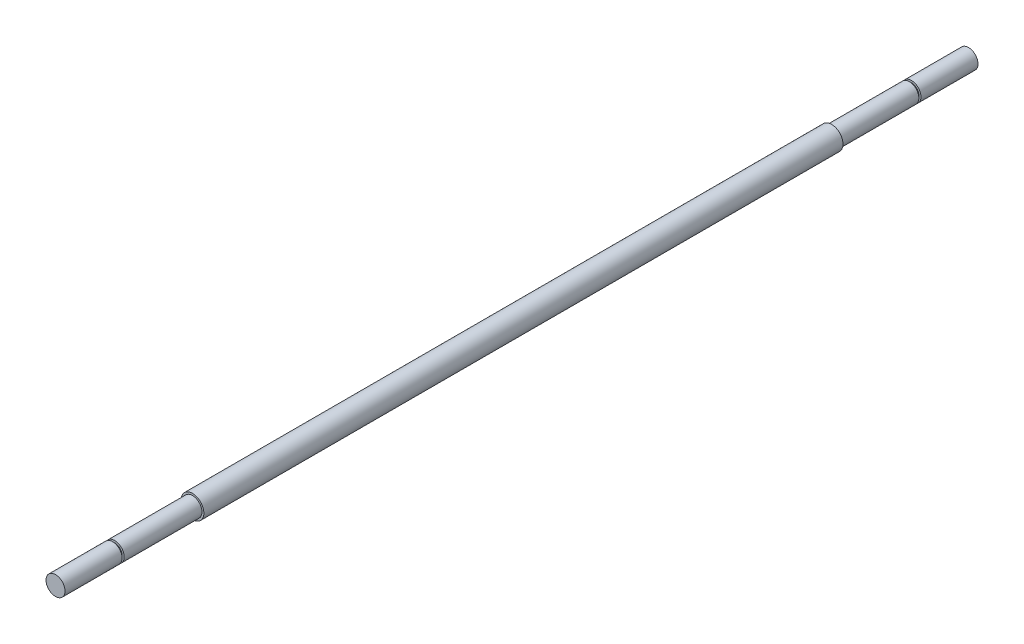
ISO-10303-21;
HEADER;
FILE_DESCRIPTION(('STEP AP214'),'2;1');
FILE_NAME('part.step','',(''),(''),'','','');
FILE_SCHEMA(('AUTOMOTIVE_DESIGN { 1 0 10303 214 1 1 1 1 }'));
ENDSEC;
DATA;
#1=APPLICATION_CONTEXT('core data for automotive mechanical design processes');
#2=APPLICATION_PROTOCOL_DEFINITION('international standard','automotive_design',2000,#1);
#3=PRODUCT_CONTEXT('',#1,'mechanical');
#4=PRODUCT('Part','Part','',(#3));
#5=PRODUCT_RELATED_PRODUCT_CATEGORY('part','',(#4));
#6=PRODUCT_DEFINITION_FORMATION('','',#4);
#7=PRODUCT_DEFINITION_CONTEXT('part definition',#1,'design');
#8=PRODUCT_DEFINITION('design','',#6,#7);
#9=PRODUCT_DEFINITION_SHAPE('','',#8);
#10=(LENGTH_UNIT() NAMED_UNIT(*) SI_UNIT(.MILLI.,.METRE.));
#11=(NAMED_UNIT(*) PLANE_ANGLE_UNIT() SI_UNIT($,.RADIAN.));
#12=(NAMED_UNIT(*) SI_UNIT($,.STERADIAN.) SOLID_ANGLE_UNIT());
#13=UNCERTAINTY_MEASURE_WITH_UNIT(LENGTH_MEASURE(1.E-05),#10,'distance_accuracy_value','');
#14=(GEOMETRIC_REPRESENTATION_CONTEXT(3) GLOBAL_UNCERTAINTY_ASSIGNED_CONTEXT((#13)) GLOBAL_UNIT_ASSIGNED_CONTEXT((#10,
#11,#12)) REPRESENTATION_CONTEXT('',''));
#15=CARTESIAN_POINT('',(0.,0.,0.));
#16=DIRECTION('',(0.,0.,1.));
#17=DIRECTION('',(1.,0.,0.));
#18=AXIS2_PLACEMENT_3D('',#15,#16,#17);
#19=CARTESIAN_POINT('',(0.,0.,608.819798673658));
#20=DIRECTION('',(0.,0.,1.));
#21=DIRECTION('',(-1.,0.,0.));
#22=AXIS2_PLACEMENT_3D('',#19,#20,#21);
#23=CYLINDRICAL_SURFACE('',#22,6.35);
#24=CARTESIAN_POINT('',(0.,0.,518.16));
#25=DIRECTION('',(0.,0.,-1.));
#26=DIRECTION('',(-1.,0.,0.));
#27=AXIS2_PLACEMENT_3D('',#24,#25,#26);
#28=CIRCLE('',#27,6.35);
#29=CARTESIAN_POINT('',(-6.35,0.,518.16));
#30=VERTEX_POINT('',#29);
#31=EDGE_CURVE('E75',#30,#30,#28,.T.);
#32=ORIENTED_EDGE('',*,*,#31,.F.);
#33=EDGE_LOOP('',(#32));
#34=FACE_BOUND('',#33,.T.);
#35=CARTESIAN_POINT('',(0.,0.,570.103));
#36=DIRECTION('',(0.,0.,1.));
#37=DIRECTION('',(1.,0.,0.));
#38=AXIS2_PLACEMENT_3D('',#35,#36,#37);
#39=CIRCLE('',#38,6.35);
#40=CARTESIAN_POINT('',(6.35,0.,570.103));
#41=VERTEX_POINT('',#40);
#42=EDGE_CURVE('E65',#41,#41,#39,.T.);
#43=ORIENTED_EDGE('',*,*,#42,.F.);
#44=EDGE_LOOP('',(#43));
#45=FACE_BOUND('',#44,.T.);
#46=ADVANCED_FACE('F37',(#34,#45),#23,.T.);
#47=CARTESIAN_POINT('',(0.,0.,609.6));
#48=DIRECTION('',(0.,0.,-1.));
#49=DIRECTION('',(-1.,0.,0.));
#50=AXIS2_PLACEMENT_3D('',#47,#48,#49);
#51=CYLINDRICAL_SURFACE('',#50,7.62);
#52=CARTESIAN_POINT('',(0.,0.,91.44));
#53=DIRECTION('',(0.,0.,-1.));
#54=DIRECTION('',(-1.,0.,0.));
#55=AXIS2_PLACEMENT_3D('',#52,#53,#54);
#56=CIRCLE('',#55,7.62);
#57=CARTESIAN_POINT('',(-7.62,0.,91.44));
#58=VERTEX_POINT('',#57);
#59=EDGE_CURVE('E10',#58,#58,#56,.T.);
#60=CARTESIAN_POINT('',(0.,0.,518.16));
#61=DIRECTION('',(0.,0.,-1.));
#62=DIRECTION('',(-1.,0.,0.));
#63=AXIS2_PLACEMENT_3D('',#60,#61,#62);
#64=CIRCLE('',#63,7.62);
#65=CARTESIAN_POINT('',(-7.62,0.,518.16));
#66=VERTEX_POINT('',#65);
#67=EDGE_CURVE('E93',#66,#66,#64,.T.);
#68=CARTESIAN_POINT('',(-7.62,0.,91.44));
#69=CARTESIAN_POINT('',(-7.62,0.,95.885));
#70=CARTESIAN_POINT('',(-7.62,0.,100.33));
#71=CARTESIAN_POINT('',(-7.62,0.,109.22));
#72=CARTESIAN_POINT('',(-7.62,0.,113.665));
#73=CARTESIAN_POINT('',(-7.62,0.,122.555));
#74=CARTESIAN_POINT('',(-7.62,0.,127.));
#75=CARTESIAN_POINT('',(-7.62,0.,135.89));
#76=CARTESIAN_POINT('',(-7.62,0.,140.335));
#77=CARTESIAN_POINT('',(-7.62,0.,149.225));
#78=CARTESIAN_POINT('',(-7.62,0.,153.67));
#79=CARTESIAN_POINT('',(-7.62,0.,162.56));
#80=CARTESIAN_POINT('',(-7.62,0.,167.005));
#81=CARTESIAN_POINT('',(-7.62,0.,175.895));
#82=CARTESIAN_POINT('',(-7.62,0.,180.34));
#83=CARTESIAN_POINT('',(-7.62,0.,189.23));
#84=CARTESIAN_POINT('',(-7.62,0.,193.675));
#85=CARTESIAN_POINT('',(-7.62,0.,202.565));
#86=CARTESIAN_POINT('',(-7.62,0.,207.01));
#87=CARTESIAN_POINT('',(-7.62,0.,215.9));
#88=CARTESIAN_POINT('',(-7.62,0.,220.345));
#89=CARTESIAN_POINT('',(-7.62,0.,229.235));
#90=CARTESIAN_POINT('',(-7.62,0.,233.68));
#91=CARTESIAN_POINT('',(-7.62,0.,242.57));
#92=CARTESIAN_POINT('',(-7.62,0.,247.015));
#93=CARTESIAN_POINT('',(-7.62,0.,255.905));
#94=CARTESIAN_POINT('',(-7.62,0.,260.35));
#95=CARTESIAN_POINT('',(-7.62,0.,269.24));
#96=CARTESIAN_POINT('',(-7.62,0.,273.685));
#97=CARTESIAN_POINT('',(-7.62,0.,282.575));
#98=CARTESIAN_POINT('',(-7.62,0.,287.02));
#99=CARTESIAN_POINT('',(-7.62,0.,295.91));
#100=CARTESIAN_POINT('',(-7.62,0.,300.355));
#101=CARTESIAN_POINT('',(-7.62,0.,309.245));
#102=CARTESIAN_POINT('',(-7.62,0.,313.69));
#103=CARTESIAN_POINT('',(-7.62,0.,322.58));
#104=CARTESIAN_POINT('',(-7.62,0.,327.025));
#105=CARTESIAN_POINT('',(-7.62,0.,335.915));
#106=CARTESIAN_POINT('',(-7.62,0.,340.36));
#107=CARTESIAN_POINT('',(-7.62,0.,349.25));
#108=CARTESIAN_POINT('',(-7.62,0.,353.695));
#109=CARTESIAN_POINT('',(-7.62,0.,362.585));
#110=CARTESIAN_POINT('',(-7.62,0.,367.03));
#111=CARTESIAN_POINT('',(-7.62,0.,375.92));
#112=CARTESIAN_POINT('',(-7.62,0.,380.365));
#113=CARTESIAN_POINT('',(-7.62,0.,389.255));
#114=CARTESIAN_POINT('',(-7.62,0.,393.7));
#115=CARTESIAN_POINT('',(-7.62,0.,402.59));
#116=CARTESIAN_POINT('',(-7.62,0.,407.035));
#117=CARTESIAN_POINT('',(-7.62,0.,415.925));
#118=CARTESIAN_POINT('',(-7.62,0.,420.37));
#119=CARTESIAN_POINT('',(-7.62,0.,429.26));
#120=CARTESIAN_POINT('',(-7.62,0.,433.705));
#121=CARTESIAN_POINT('',(-7.62,0.,442.595));
#122=CARTESIAN_POINT('',(-7.62,0.,447.04));
#123=CARTESIAN_POINT('',(-7.62,0.,455.93));
#124=CARTESIAN_POINT('',(-7.62,0.,460.375));
#125=CARTESIAN_POINT('',(-7.62,0.,469.265));
#126=CARTESIAN_POINT('',(-7.62,0.,473.71));
#127=CARTESIAN_POINT('',(-7.62,0.,482.6));
#128=CARTESIAN_POINT('',(-7.62,0.,487.045));
#129=CARTESIAN_POINT('',(-7.62,0.,495.935));
#130=CARTESIAN_POINT('',(-7.62,0.,500.38));
#131=CARTESIAN_POINT('',(-7.62,0.,509.27));
#132=CARTESIAN_POINT('',(-7.62,0.,513.715));
#133=CARTESIAN_POINT('',(-7.62,0.,518.16));
#134=B_SPLINE_CURVE_WITH_KNOTS('',3,(#68,#69,#70,#71,#72,#73,#74,#75,#76,#77,#78,#79,#80,#81,
#82,#83,#84,#85,#86,#87,#88,#89,#90,#91,#92,#93,#94,#95,#96,#97,#98,#99,#100,#101,#102,#103,
#104,#105,#106,#107,#108,#109,#110,#111,#112,#113,#114,#115,#116,#117,#118,#119,#120,#121,#122,
#123,#124,#125,#126,#127,#128,#129,#130,#131,#132,#133),.UNSPECIFIED.,.F.,.F.,(4,2,2,2,2,2,2,2,
2,2,2,2,2,2,2,2,2,2,2,2,2,2,2,2,2,2,2,2,2,2,2,2,4),(0.,13.335,26.67,40.005,53.34,66.675,80.01,
93.345,106.68,120.015,133.35,146.685,160.02,173.355,186.69,200.025,213.36,226.695,240.03,
253.365,266.7,280.035,293.37,306.705,320.04,333.375,346.71,360.045,373.38,386.715,400.05,
413.385,426.72),.UNSPECIFIED.);
#135=EDGE_CURVE('BSEAM39',#58,#66,#134,.T.);
#136=ORIENTED_EDGE('',*,*,#59,.F.);
#137=ORIENTED_EDGE('',*,*,#67,.T.);
#138=ORIENTED_EDGE('',*,*,#135,.T.);
#139=ORIENTED_EDGE('',*,*,#135,.F.);
#140=EDGE_LOOP('',(#136,#138,#137,#139));
#141=FACE_BOUND('',#140,.T.);
#142=ADVANCED_FACE('F39',(#141),#51,.T.);
#143=CARTESIAN_POINT('',(0.,0.,0.78020132634235));
#144=DIRECTION('',(0.,0.,-1.));
#145=DIRECTION('',(-1.,0.,0.));
#146=AXIS2_PLACEMENT_3D('',#143,#144,#145);
#147=CYLINDRICAL_SURFACE('',#146,6.35);
#148=CARTESIAN_POINT('',(0.,0.,91.44));
#149=DIRECTION('',(0.,0.,-1.));
#150=DIRECTION('',(-1.,0.,0.));
#151=AXIS2_PLACEMENT_3D('',#148,#149,#150);
#152=CIRCLE('',#151,6.35);
#153=CARTESIAN_POINT('',(-6.35,0.,91.44));
#154=VERTEX_POINT('',#153);
#155=EDGE_CURVE('E53',#154,#154,#152,.T.);
#156=ORIENTED_EDGE('',*,*,#155,.T.);
#157=EDGE_LOOP('',(#156));
#158=FACE_BOUND('',#157,.T.);
#159=CARTESIAN_POINT('',(0.,0.,39.497));
#160=DIRECTION('',(0.,0.,-1.));
#161=DIRECTION('',(-1.,0.,0.));
#162=AXIS2_PLACEMENT_3D('',#159,#160,#161);
#163=CIRCLE('',#162,6.35);
#164=CARTESIAN_POINT('',(-6.35,0.,39.497));
#165=VERTEX_POINT('',#164);
#166=EDGE_CURVE('E57',#165,#165,#163,.T.);
#167=ORIENTED_EDGE('',*,*,#166,.F.);
#168=EDGE_LOOP('',(#167));
#169=FACE_BOUND('',#168,.T.);
#170=ADVANCED_FACE('F108',(#158,#169),#147,.T.);
#171=CARTESIAN_POINT('',(6.35,0.,91.44));
#172=DIRECTION('',(0.,0.,-1.));
#173=DIRECTION('',(-1.,0.,0.));
#174=AXIS2_PLACEMENT_3D('',#171,#172,#173);
#175=PLANE('',#174);
#176=ORIENTED_EDGE('',*,*,#59,.T.);
#177=EDGE_LOOP('',(#176));
#178=FACE_BOUND('',#177,.T.);
#179=ORIENTED_EDGE('',*,*,#155,.F.);
#180=EDGE_LOOP('',(#179));
#181=FACE_BOUND('',#180,.T.);
#182=ADVANCED_FACE('F111',(#178,#181),#175,.T.);
#183=CARTESIAN_POINT('',(7.6708,0.,38.1));
#184=DIRECTION('',(0.,0.,1.));
#185=DIRECTION('',(1.,0.,0.));
#186=AXIS2_PLACEMENT_3D('',#183,#184,#185);
#187=PLANE('',#186);
#188=CARTESIAN_POINT('',(0.,0.,38.1));
#189=DIRECTION('',(0.,0.,-1.));
#190=DIRECTION('',(-1.,0.,0.));
#191=AXIS2_PLACEMENT_3D('',#188,#189,#190);
#192=CIRCLE('',#191,5.0292);
#193=CARTESIAN_POINT('',(-5.0292,0.,38.1));
#194=VERTEX_POINT('',#193);
#195=EDGE_CURVE('E62',#194,#194,#192,.T.);
#196=ORIENTED_EDGE('',*,*,#195,.T.);
#197=EDGE_LOOP('',(#196));
#198=FACE_BOUND('',#197,.T.);
#199=CARTESIAN_POINT('',(0.,0.,38.1));
#200=DIRECTION('',(0.,0.,1.));
#201=DIRECTION('',(1.,0.,0.));
#202=AXIS2_PLACEMENT_3D('',#199,#200,#201);
#203=CIRCLE('',#202,6.35);
#204=CARTESIAN_POINT('',(6.35,0.,38.1));
#205=VERTEX_POINT('',#204);
#206=EDGE_CURVE('E61',#205,#205,#203,.T.);
#207=ORIENTED_EDGE('',*,*,#206,.T.);
#208=EDGE_LOOP('',(#207));
#209=FACE_BOUND('',#208,.T.);
#210=ADVANCED_FACE('F113',(#198,#209),#187,.T.);
#211=CARTESIAN_POINT('',(7.6708,0.,39.497));
#212=DIRECTION('',(0.,0.,-1.));
#213=DIRECTION('',(-1.,0.,0.));
#214=AXIS2_PLACEMENT_3D('',#211,#212,#213);
#215=PLANE('',#214);
#216=CARTESIAN_POINT('',(0.,0.,39.497));
#217=DIRECTION('',(0.,0.,-1.));
#218=DIRECTION('',(-1.,0.,0.));
#219=AXIS2_PLACEMENT_3D('',#216,#217,#218);
#220=CIRCLE('',#219,5.0292);
#221=CARTESIAN_POINT('',(-5.0292,0.,39.497));
#222=VERTEX_POINT('',#221);
#223=EDGE_CURVE('E97',#222,#222,#220,.T.);
#224=ORIENTED_EDGE('',*,*,#223,.F.);
#225=EDGE_LOOP('',(#224));
#226=FACE_BOUND('',#225,.T.);
#227=ORIENTED_EDGE('',*,*,#166,.T.);
#228=EDGE_LOOP('',(#227));
#229=FACE_BOUND('',#228,.T.);
#230=ADVANCED_FACE('F119',(#226,#229),#215,.T.);
#231=CARTESIAN_POINT('',(0.,0.,0.));
#232=DIRECTION('',(0.,0.,-1.));
#233=DIRECTION('',(-1.,0.,0.));
#234=AXIS2_PLACEMENT_3D('',#231,#232,#233);
#235=CYLINDRICAL_SURFACE('',#234,5.0292);
#236=ORIENTED_EDGE('',*,*,#223,.T.);
#237=EDGE_LOOP('',(#236));
#238=FACE_BOUND('',#237,.T.);
#239=ORIENTED_EDGE('',*,*,#195,.F.);
#240=EDGE_LOOP('',(#239));
#241=FACE_BOUND('',#240,.T.);
#242=ADVANCED_FACE('F231',(#238,#241),#235,.T.);
#243=CARTESIAN_POINT('',(0.,0.,0.));
#244=DIRECTION('',(0.,0.,1.));
#245=DIRECTION('',(1.,0.,0.));
#246=AXIS2_PLACEMENT_3D('',#243,#244,#245);
#247=PLANE('',#246);
#248=CARTESIAN_POINT('',(0.,0.,0.));
#249=DIRECTION('',(0.,0.,-1.));
#250=DIRECTION('',(-1.,0.,0.));
#251=AXIS2_PLACEMENT_3D('',#248,#249,#250);
#252=CIRCLE('',#251,6.35);
#253=CARTESIAN_POINT('',(-6.35,0.,0.));
#254=VERTEX_POINT('',#253);
#255=EDGE_CURVE('E46',#254,#254,#252,.T.);
#256=ORIENTED_EDGE('',*,*,#255,.T.);
#257=EDGE_LOOP('',(#256));
#258=FACE_BOUND('',#257,.T.);
#259=ADVANCED_FACE('F223',(#258),#247,.F.);
#260=ORIENTED_EDGE('',*,*,#255,.F.);
#261=EDGE_LOOP('',(#260));
#262=FACE_BOUND('',#261,.T.);
#263=ORIENTED_EDGE('',*,*,#206,.F.);
#264=EDGE_LOOP('',(#263));
#265=FACE_BOUND('',#264,.T.);
#266=ADVANCED_FACE('F123',(#262,#265),#147,.T.);
#267=CARTESIAN_POINT('',(6.35,0.,518.16));
#268=DIRECTION('',(0.,0.,1.));
#269=DIRECTION('',(-1.,0.,0.));
#270=AXIS2_PLACEMENT_3D('',#267,#268,#269);
#271=PLANE('',#270);
#272=ORIENTED_EDGE('',*,*,#67,.F.);
#273=EDGE_LOOP('',(#272));
#274=FACE_BOUND('',#273,.T.);
#275=ORIENTED_EDGE('',*,*,#31,.T.);
#276=EDGE_LOOP('',(#275));
#277=FACE_BOUND('',#276,.T.);
#278=ADVANCED_FACE('F152',(#274,#277),#271,.T.);
#279=CARTESIAN_POINT('',(7.6708,0.,571.5));
#280=DIRECTION('',(0.,0.,-1.));
#281=DIRECTION('',(1.,0.,0.));
#282=AXIS2_PLACEMENT_3D('',#279,#280,#281);
#283=PLANE('',#282);
#284=CARTESIAN_POINT('',(0.,0.,571.5));
#285=DIRECTION('',(0.,0.,-1.));
#286=DIRECTION('',(-1.,0.,0.));
#287=AXIS2_PLACEMENT_3D('',#284,#285,#286);
#288=CIRCLE('',#287,5.0292);
#289=CARTESIAN_POINT('',(-5.0292,0.,571.5));
#290=VERTEX_POINT('',#289);
#291=EDGE_CURVE('E68',#290,#290,#288,.T.);
#292=ORIENTED_EDGE('',*,*,#291,.F.);
#293=EDGE_LOOP('',(#292));
#294=FACE_BOUND('',#293,.T.);
#295=CARTESIAN_POINT('',(0.,0.,571.5));
#296=DIRECTION('',(0.,0.,-1.));
#297=DIRECTION('',(-1.,0.,0.));
#298=AXIS2_PLACEMENT_3D('',#295,#296,#297);
#299=CIRCLE('',#298,6.35);
#300=CARTESIAN_POINT('',(-6.35,0.,571.5));
#301=VERTEX_POINT('',#300);
#302=EDGE_CURVE('E41',#301,#301,#299,.T.);
#303=ORIENTED_EDGE('',*,*,#302,.T.);
#304=EDGE_LOOP('',(#303));
#305=FACE_BOUND('',#304,.T.);
#306=ADVANCED_FACE('F149',(#294,#305),#283,.T.);
#307=CARTESIAN_POINT('',(7.6708,0.,570.103));
#308=DIRECTION('',(0.,0.,1.));
#309=DIRECTION('',(-1.,0.,0.));
#310=AXIS2_PLACEMENT_3D('',#307,#308,#309);
#311=PLANE('',#310);
#312=CARTESIAN_POINT('',(0.,0.,570.103));
#313=DIRECTION('',(0.,0.,-1.));
#314=DIRECTION('',(-1.,0.,0.));
#315=AXIS2_PLACEMENT_3D('',#312,#313,#314);
#316=CIRCLE('',#315,5.0292);
#317=CARTESIAN_POINT('',(-5.0292,0.,570.103));
#318=VERTEX_POINT('',#317);
#319=EDGE_CURVE('E77',#318,#318,#316,.T.);
#320=ORIENTED_EDGE('',*,*,#319,.T.);
#321=EDGE_LOOP('',(#320));
#322=FACE_BOUND('',#321,.T.);
#323=ORIENTED_EDGE('',*,*,#42,.T.);
#324=EDGE_LOOP('',(#323));
#325=FACE_BOUND('',#324,.T.);
#326=ADVANCED_FACE('F151',(#322,#325),#311,.T.);
#327=CARTESIAN_POINT('',(0.,0.,609.6));
#328=DIRECTION('',(0.,0.,1.));
#329=DIRECTION('',(-1.,0.,0.));
#330=AXIS2_PLACEMENT_3D('',#327,#328,#329);
#331=CYLINDRICAL_SURFACE('',#330,5.0292);
#332=ORIENTED_EDGE('',*,*,#319,.F.);
#333=EDGE_LOOP('',(#332));
#334=FACE_BOUND('',#333,.T.);
#335=ORIENTED_EDGE('',*,*,#291,.T.);
#336=EDGE_LOOP('',(#335));
#337=FACE_BOUND('',#336,.T.);
#338=ADVANCED_FACE('F143',(#334,#337),#331,.T.);
#339=CARTESIAN_POINT('',(0.,0.,609.6));
#340=DIRECTION('',(0.,0.,1.));
#341=DIRECTION('',(1.,0.,0.));
#342=AXIS2_PLACEMENT_3D('',#339,#340,#341);
#343=PLANE('',#342);
#344=CARTESIAN_POINT('',(0.,0.,609.6));
#345=DIRECTION('',(0.,0.,-1.));
#346=DIRECTION('',(-1.,0.,0.));
#347=AXIS2_PLACEMENT_3D('',#344,#345,#346);
#348=CIRCLE('',#347,6.35);
#349=CARTESIAN_POINT('',(-6.35,0.,609.6));
#350=VERTEX_POINT('',#349);
#351=EDGE_CURVE('E89',#350,#350,#348,.T.);
#352=ORIENTED_EDGE('',*,*,#351,.F.);
#353=EDGE_LOOP('',(#352));
#354=FACE_BOUND('',#353,.T.);
#355=ADVANCED_FACE('F138',(#354),#343,.T.);
#356=ORIENTED_EDGE('',*,*,#351,.T.);
#357=EDGE_LOOP('',(#356));
#358=FACE_BOUND('',#357,.T.);
#359=ORIENTED_EDGE('',*,*,#302,.F.);
#360=EDGE_LOOP('',(#359));
#361=FACE_BOUND('',#360,.T.);
#362=ADVANCED_FACE('F128',(#358,#361),#23,.T.);
#363=CLOSED_SHELL('',(#46,#142,#170,#182,#210,#230,#242,#259,#266,#278,#306,#326,#338,#355,#362));
#364=MANIFOLD_SOLID_BREP('B2',#363);
#365=ADVANCED_BREP_SHAPE_REPRESENTATION('',(#18,#364),#14);
#366=SHAPE_DEFINITION_REPRESENTATION(#9,#365);
ENDSEC;
END-ISO-10303-21;
